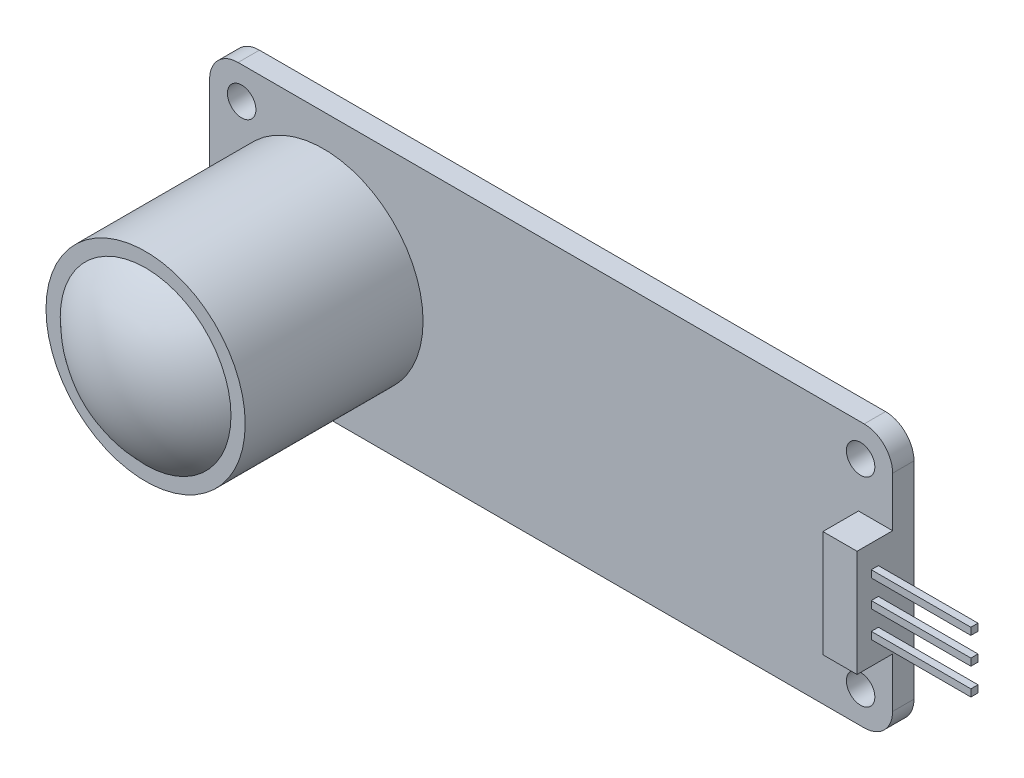
ISO-10303-21;
HEADER;
FILE_DESCRIPTION(('STEP AP214'),'2;1');
FILE_NAME('part.step','',(''),(''),'','','');
FILE_SCHEMA(('AUTOMOTIVE_DESIGN { 1 0 10303 214 1 1 1 1 }'));
ENDSEC;
DATA;
#1=APPLICATION_CONTEXT('core data for automotive mechanical design processes');
#2=APPLICATION_PROTOCOL_DEFINITION('international standard','automotive_design',2000,#1);
#3=PRODUCT_CONTEXT('',#1,'mechanical');
#4=PRODUCT('Part','Part','',(#3));
#5=PRODUCT_RELATED_PRODUCT_CATEGORY('part','',(#4));
#6=PRODUCT_DEFINITION_FORMATION('','',#4);
#7=PRODUCT_DEFINITION_CONTEXT('part definition',#1,'design');
#8=PRODUCT_DEFINITION('design','',#6,#7);
#9=PRODUCT_DEFINITION_SHAPE('','',#8);
#10=(LENGTH_UNIT() NAMED_UNIT(*) SI_UNIT(.MILLI.,.METRE.));
#11=(NAMED_UNIT(*) PLANE_ANGLE_UNIT() SI_UNIT($,.RADIAN.));
#12=(NAMED_UNIT(*) SI_UNIT($,.STERADIAN.) SOLID_ANGLE_UNIT());
#13=UNCERTAINTY_MEASURE_WITH_UNIT(LENGTH_MEASURE(1.E-05),#10,'distance_accuracy_value','');
#14=(GEOMETRIC_REPRESENTATION_CONTEXT(3) GLOBAL_UNCERTAINTY_ASSIGNED_CONTEXT((#13)) GLOBAL_UNIT_ASSIGNED_CONTEXT((#10,
#11,#12)) REPRESENTATION_CONTEXT('',''));
#15=CARTESIAN_POINT('',(0.,0.,0.));
#16=DIRECTION('',(0.,0.,1.));
#17=DIRECTION('',(1.,0.,0.));
#18=AXIS2_PLACEMENT_3D('',#15,#16,#17);
#19=CARTESIAN_POINT('',(24.,-9.25,1.5));
#20=DIRECTION('',(-1.,0.,0.));
#21=DIRECTION('',(0.,0.,1.));
#22=AXIS2_PLACEMENT_3D('',#19,#20,#21);
#23=PLANE('',#22);
#24=DIRECTION('',(0.,1.,0.));
#25=VECTOR('',#24,1.);
#26=CARTESIAN_POINT('',(24.,-0.25,2.5));
#27=LINE('',#26,#25);
#28=CARTESIAN_POINT('',(24.,-0.25,2.5));
#29=VERTEX_POINT('',#28);
#30=CARTESIAN_POINT('',(24.,0.25,2.5));
#31=VERTEX_POINT('',#30);
#32=EDGE_CURVE('E258',#29,#31,#27,.T.);
#33=ORIENTED_EDGE('',*,*,#32,.F.);
#34=DIRECTION('',(0.,0.,-1.));
#35=VECTOR('',#34,1.);
#36=CARTESIAN_POINT('',(24.,-0.25,3.));
#37=LINE('',#36,#35);
#38=CARTESIAN_POINT('',(24.,-0.25,3.));
#39=VERTEX_POINT('',#38);
#40=EDGE_CURVE('E248',#39,#29,#37,.T.);
#41=ORIENTED_EDGE('',*,*,#40,.F.);
#42=DIRECTION('',(0.,-1.,0.));
#43=VECTOR('',#42,1.);
#44=CARTESIAN_POINT('',(24.,-0.25,3.));
#45=LINE('',#44,#43);
#46=CARTESIAN_POINT('',(24.,0.25,3.));
#47=VERTEX_POINT('',#46);
#48=EDGE_CURVE('E251',#47,#39,#45,.T.);
#49=ORIENTED_EDGE('',*,*,#48,.F.);
#50=DIRECTION('',(0.,0.,1.));
#51=VECTOR('',#50,1.);
#52=CARTESIAN_POINT('',(24.,0.25,3.));
#53=LINE('',#52,#51);
#54=EDGE_CURVE('E255',#31,#47,#53,.T.);
#55=ORIENTED_EDGE('',*,*,#54,.F.);
#56=EDGE_LOOP('',(#33,#41,#49,#55));
#57=FACE_BOUND('',#56,.T.);
#58=DIRECTION('',(0.,1.,0.));
#59=VECTOR('',#58,1.);
#60=CARTESIAN_POINT('',(24.,-9.25,1.5));
#61=LINE('',#60,#59);
#62=CARTESIAN_POINT('',(24.,-7.25,1.5));
#63=VERTEX_POINT('',#62);
#64=CARTESIAN_POINT('',(24.,-3.75,1.5));
#65=VERTEX_POINT('',#64);
#66=EDGE_CURVE('E359',#63,#65,#61,.T.);
#67=ORIENTED_EDGE('',*,*,#66,.F.);
#68=DIRECTION('',(0.,0.,-1.));
#69=VECTOR('',#68,1.);
#70=CARTESIAN_POINT('',(24.,-7.25,1.5));
#71=LINE('',#70,#69);
#72=CARTESIAN_POINT('',(24.,-7.25,0.));
#73=VERTEX_POINT('',#72);
#74=EDGE_CURVE('E416',#63,#73,#71,.T.);
#75=ORIENTED_EDGE('',*,*,#74,.T.);
#76=DIRECTION('',(0.,1.,0.));
#77=VECTOR('',#76,1.);
#78=CARTESIAN_POINT('',(24.,-9.25,0.));
#79=LINE('',#78,#77);
#80=CARTESIAN_POINT('',(24.,7.25,0.));
#81=VERTEX_POINT('',#80);
#82=EDGE_CURVE('E356',#73,#81,#79,.T.);
#83=ORIENTED_EDGE('',*,*,#82,.T.);
#84=DIRECTION('',(0.,0.,-1.));
#85=VECTOR('',#84,1.);
#86=CARTESIAN_POINT('',(24.,7.25,1.5));
#87=LINE('',#86,#85);
#88=CARTESIAN_POINT('',(24.,7.25,1.5));
#89=VERTEX_POINT('',#88);
#90=EDGE_CURVE('E413',#81,#89,#87,.F.);
#91=ORIENTED_EDGE('',*,*,#90,.T.);
#92=CARTESIAN_POINT('',(24.,3.75,1.5));
#93=VERTEX_POINT('',#92);
#94=EDGE_CURVE('E362',#93,#89,#61,.T.);
#95=ORIENTED_EDGE('',*,*,#94,.F.);
#96=DIRECTION('',(0.,0.,-1.));
#97=VECTOR('',#96,1.);
#98=CARTESIAN_POINT('',(24.,3.75,4.));
#99=LINE('',#98,#97);
#100=CARTESIAN_POINT('',(24.,3.75,4.));
#101=VERTEX_POINT('',#100);
#102=EDGE_CURVE('E328',#101,#93,#99,.T.);
#103=ORIENTED_EDGE('',*,*,#102,.F.);
#104=DIRECTION('',(0.,1.,0.));
#105=VECTOR('',#104,1.);
#106=CARTESIAN_POINT('',(24.,-3.75,4.));
#107=LINE('',#106,#105);
#108=CARTESIAN_POINT('',(24.,-3.75,4.));
#109=VERTEX_POINT('',#108);
#110=EDGE_CURVE('E302',#109,#101,#107,.T.);
#111=ORIENTED_EDGE('',*,*,#110,.F.);
#112=DIRECTION('',(0.,0.,-1.));
#113=VECTOR('',#112,1.);
#114=CARTESIAN_POINT('',(24.,-3.75,4.));
#115=LINE('',#114,#113);
#116=EDGE_CURVE('E312',#109,#65,#115,.T.);
#117=ORIENTED_EDGE('',*,*,#116,.T.);
#118=EDGE_LOOP('',(#67,#75,#83,#91,#95,#103,#111,#117));
#119=FACE_BOUND('',#118,.T.);
#120=DIRECTION('',(0.,1.,0.));
#121=VECTOR('',#120,1.);
#122=CARTESIAN_POINT('',(24.,1.625,2.5));
#123=LINE('',#122,#121);
#124=CARTESIAN_POINT('',(24.,1.625,2.5));
#125=VERTEX_POINT('',#124);
#126=CARTESIAN_POINT('',(24.,2.125,2.5));
#127=VERTEX_POINT('',#126);
#128=EDGE_CURVE('E261',#125,#127,#123,.T.);
#129=ORIENTED_EDGE('',*,*,#128,.F.);
#130=DIRECTION('',(0.,0.,-1.));
#131=VECTOR('',#130,1.);
#132=CARTESIAN_POINT('',(24.,1.625,3.));
#133=LINE('',#132,#131);
#134=CARTESIAN_POINT('',(24.,1.625,3.));
#135=VERTEX_POINT('',#134);
#136=EDGE_CURVE('E273',#135,#125,#133,.T.);
#137=ORIENTED_EDGE('',*,*,#136,.F.);
#138=DIRECTION('',(0.,-1.,0.));
#139=VECTOR('',#138,1.);
#140=CARTESIAN_POINT('',(24.,1.625,3.));
#141=LINE('',#140,#139);
#142=CARTESIAN_POINT('',(24.,2.125,3.));
#143=VERTEX_POINT('',#142);
#144=EDGE_CURVE('E285',#143,#135,#141,.T.);
#145=ORIENTED_EDGE('',*,*,#144,.F.);
#146=DIRECTION('',(0.,0.,1.));
#147=VECTOR('',#146,1.);
#148=CARTESIAN_POINT('',(24.,2.125,3.));
#149=LINE('',#148,#147);
#150=EDGE_CURVE('E282',#127,#143,#149,.T.);
#151=ORIENTED_EDGE('',*,*,#150,.F.);
#152=EDGE_LOOP('',(#129,#137,#145,#151));
#153=FACE_BOUND('',#152,.T.);
#154=DIRECTION('',(0.,1.,0.));
#155=VECTOR('',#154,1.);
#156=CARTESIAN_POINT('',(24.,-2.125,2.5));
#157=LINE('',#156,#155);
#158=CARTESIAN_POINT('',(24.,-2.125,2.5));
#159=VERTEX_POINT('',#158);
#160=CARTESIAN_POINT('',(24.,-1.625,2.5));
#161=VERTEX_POINT('',#160);
#162=EDGE_CURVE('E201',#159,#161,#157,.T.);
#163=ORIENTED_EDGE('',*,*,#162,.F.);
#164=DIRECTION('',(0.,0.,-1.));
#165=VECTOR('',#164,1.);
#166=CARTESIAN_POINT('',(24.,-2.125,3.));
#167=LINE('',#166,#165);
#168=CARTESIAN_POINT('',(24.,-2.125,3.));
#169=VERTEX_POINT('',#168);
#170=EDGE_CURVE('E203',#169,#159,#167,.T.);
#171=ORIENTED_EDGE('',*,*,#170,.F.);
#172=DIRECTION('',(0.,-1.,0.));
#173=VECTOR('',#172,1.);
#174=CARTESIAN_POINT('',(24.,-2.125,3.));
#175=LINE('',#174,#173);
#176=CARTESIAN_POINT('',(24.,-1.625,3.));
#177=VERTEX_POINT('',#176);
#178=EDGE_CURVE('E64',#177,#169,#175,.T.);
#179=ORIENTED_EDGE('',*,*,#178,.F.);
#180=DIRECTION('',(0.,0.,1.));
#181=VECTOR('',#180,1.);
#182=CARTESIAN_POINT('',(24.,-1.625,3.));
#183=LINE('',#182,#181);
#184=EDGE_CURVE('E59',#161,#177,#183,.T.);
#185=ORIENTED_EDGE('',*,*,#184,.F.);
#186=EDGE_LOOP('',(#163,#171,#179,#185));
#187=FACE_BOUND('',#186,.T.);
#188=ADVANCED_FACE('F44',(#57,#119,#153,#187),#23,.F.);
#189=CARTESIAN_POINT('',(0.,0.,1.5));
#190=DIRECTION('',(0.,0.,-1.));
#191=DIRECTION('',(-1.,0.,0.));
#192=AXIS2_PLACEMENT_3D('',#189,#190,#191);
#193=PLANE('',#192);
#194=CARTESIAN_POINT('',(-21.75,-7.,1.5));
#195=DIRECTION('',(0.,0.,1.));
#196=DIRECTION('',(1.,0.,0.));
#197=AXIS2_PLACEMENT_3D('',#194,#195,#196);
#198=CIRCLE('',#197,1.);
#199=CARTESIAN_POINT('',(-20.75,-7.,1.5));
#200=VERTEX_POINT('',#199);
#201=EDGE_CURVE('E335',#200,#200,#198,.T.);
#202=ORIENTED_EDGE('',*,*,#201,.F.);
#203=EDGE_LOOP('',(#202));
#204=FACE_BOUND('',#203,.T.);
#205=CARTESIAN_POINT('',(21.75,-7.,1.5));
#206=DIRECTION('',(0.,0.,1.));
#207=DIRECTION('',(1.,0.,0.));
#208=AXIS2_PLACEMENT_3D('',#205,#206,#207);
#209=CIRCLE('',#208,1.);
#210=CARTESIAN_POINT('',(22.75,-7.,1.5));
#211=VERTEX_POINT('',#210);
#212=EDGE_CURVE('E341',#211,#211,#209,.T.);
#213=ORIENTED_EDGE('',*,*,#212,.F.);
#214=EDGE_LOOP('',(#213));
#215=FACE_BOUND('',#214,.T.);
#216=CARTESIAN_POINT('',(21.75,7.,1.5));
#217=DIRECTION('',(0.,0.,1.));
#218=DIRECTION('',(1.,0.,0.));
#219=AXIS2_PLACEMENT_3D('',#216,#217,#218);
#220=CIRCLE('',#219,1.);
#221=CARTESIAN_POINT('',(22.75,7.,1.5));
#222=VERTEX_POINT('',#221);
#223=EDGE_CURVE('E347',#222,#222,#220,.T.);
#224=ORIENTED_EDGE('',*,*,#223,.F.);
#225=EDGE_LOOP('',(#224));
#226=FACE_BOUND('',#225,.T.);
#227=CARTESIAN_POINT('',(-21.75,7.,1.5));
#228=DIRECTION('',(0.,0.,1.));
#229=DIRECTION('',(1.,0.,0.));
#230=AXIS2_PLACEMENT_3D('',#227,#228,#229);
#231=CIRCLE('',#230,1.);
#232=CARTESIAN_POINT('',(-20.75,7.,1.5));
#233=VERTEX_POINT('',#232);
#234=EDGE_CURVE('E353',#233,#233,#231,.T.);
#235=ORIENTED_EDGE('',*,*,#234,.F.);
#236=EDGE_LOOP('',(#235));
#237=FACE_BOUND('',#236,.T.);
#238=CARTESIAN_POINT('',(-16.,0.,1.5));
#239=DIRECTION('',(0.,0.,-1.));
#240=DIRECTION('',(-1.,0.,0.));
#241=AXIS2_PLACEMENT_3D('',#238,#239,#240);
#242=CIRCLE('',#241,7.);
#243=CARTESIAN_POINT('',(-23.,0.,1.5));
#244=VERTEX_POINT('',#243);
#245=EDGE_CURVE('E52',#244,#244,#242,.F.);
#246=ORIENTED_EDGE('',*,*,#245,.F.);
#247=EDGE_LOOP('',(#246));
#248=FACE_BOUND('',#247,.T.);
#249=DIRECTION('',(-1.,0.,0.));
#250=VECTOR('',#249,1.);
#251=CARTESIAN_POINT('',(24.,3.75,1.5));
#252=LINE('',#251,#250);
#253=CARTESIAN_POINT('',(21.6,3.75,1.5));
#254=VERTEX_POINT('',#253);
#255=EDGE_CURVE('E301',#93,#254,#252,.T.);
#256=ORIENTED_EDGE('',*,*,#255,.F.);
#257=ORIENTED_EDGE('',*,*,#94,.T.);
#258=CARTESIAN_POINT('',(22.,7.25,1.5));
#259=DIRECTION('',(0.,0.,-1.));
#260=DIRECTION('',(-1.,0.,0.));
#261=AXIS2_PLACEMENT_3D('',#258,#259,#260);
#262=CIRCLE('',#261,2.);
#263=CARTESIAN_POINT('',(22.,9.25,1.5));
#264=VERTEX_POINT('',#263);
#265=EDGE_CURVE('E400',#89,#264,#262,.F.);
#266=ORIENTED_EDGE('',*,*,#265,.T.);
#267=DIRECTION('',(-1.,0.,0.));
#268=VECTOR('',#267,1.);
#269=CARTESIAN_POINT('',(-24.,9.25,1.5));
#270=LINE('',#269,#268);
#271=CARTESIAN_POINT('',(-22.,9.25,1.5));
#272=VERTEX_POINT('',#271);
#273=EDGE_CURVE('E361',#264,#272,#270,.T.);
#274=ORIENTED_EDGE('',*,*,#273,.T.);
#275=CARTESIAN_POINT('',(-22.,7.25,1.5));
#276=DIRECTION('',(0.,0.,-1.));
#277=DIRECTION('',(-1.,0.,0.));
#278=AXIS2_PLACEMENT_3D('',#275,#276,#277);
#279=CIRCLE('',#278,2.);
#280=CARTESIAN_POINT('',(-24.,7.25,1.5));
#281=VERTEX_POINT('',#280);
#282=EDGE_CURVE('E404',#272,#281,#279,.F.);
#283=ORIENTED_EDGE('',*,*,#282,.T.);
#284=DIRECTION('',(0.,-1.,0.));
#285=VECTOR('',#284,1.);
#286=CARTESIAN_POINT('',(-24.,-9.25,1.5));
#287=LINE('',#286,#285);
#288=CARTESIAN_POINT('',(-24.,-7.25,1.5));
#289=VERTEX_POINT('',#288);
#290=EDGE_CURVE('E365',#281,#289,#287,.T.);
#291=ORIENTED_EDGE('',*,*,#290,.T.);
#292=CARTESIAN_POINT('',(-22.,-7.25,1.5));
#293=DIRECTION('',(0.,0.,-1.));
#294=DIRECTION('',(-1.,0.,0.));
#295=AXIS2_PLACEMENT_3D('',#292,#293,#294);
#296=CIRCLE('',#295,2.);
#297=CARTESIAN_POINT('',(-22.,-9.25,1.5));
#298=VERTEX_POINT('',#297);
#299=EDGE_CURVE('E406',#289,#298,#296,.F.);
#300=ORIENTED_EDGE('',*,*,#299,.T.);
#301=DIRECTION('',(1.,0.,0.));
#302=VECTOR('',#301,1.);
#303=CARTESIAN_POINT('',(-24.,-9.25,1.5));
#304=LINE('',#303,#302);
#305=CARTESIAN_POINT('',(22.,-9.25,1.5));
#306=VERTEX_POINT('',#305);
#307=EDGE_CURVE('E368',#298,#306,#304,.T.);
#308=ORIENTED_EDGE('',*,*,#307,.T.);
#309=CARTESIAN_POINT('',(22.,-7.25,1.5));
#310=DIRECTION('',(0.,0.,-1.));
#311=DIRECTION('',(-1.,0.,0.));
#312=AXIS2_PLACEMENT_3D('',#309,#310,#311);
#313=CIRCLE('',#312,2.);
#314=EDGE_CURVE('E402',#306,#63,#313,.F.);
#315=ORIENTED_EDGE('',*,*,#314,.T.);
#316=ORIENTED_EDGE('',*,*,#66,.T.);
#317=DIRECTION('',(1.,0.,0.));
#318=VECTOR('',#317,1.);
#319=CARTESIAN_POINT('',(24.,-3.75,1.5));
#320=LINE('',#319,#318);
#321=CARTESIAN_POINT('',(21.6,-3.75,1.5));
#322=VERTEX_POINT('',#321);
#323=EDGE_CURVE('E306',#322,#65,#320,.T.);
#324=ORIENTED_EDGE('',*,*,#323,.F.);
#325=DIRECTION('',(0.,-1.,0.));
#326=VECTOR('',#325,1.);
#327=CARTESIAN_POINT('',(21.6,-3.75,1.5));
#328=LINE('',#327,#326);
#329=EDGE_CURVE('E315',#254,#322,#328,.T.);
#330=ORIENTED_EDGE('',*,*,#329,.F.);
#331=EDGE_LOOP('',(#256,#257,#266,#274,#283,#291,#300,#308,#315,#316,#324,#330));
#332=FACE_BOUND('',#331,.T.);
#333=ADVANCED_FACE('F423',(#204,#215,#226,#237,#248,#332),#193,.F.);
#334=CARTESIAN_POINT('',(0.,0.,0.));
#335=DIRECTION('',(0.,0.,-1.));
#336=DIRECTION('',(-1.,0.,0.));
#337=AXIS2_PLACEMENT_3D('',#334,#335,#336);
#338=PLANE('',#337);
#339=CARTESIAN_POINT('',(21.75,-7.,0.));
#340=DIRECTION('',(0.,0.,1.));
#341=DIRECTION('',(1.,0.,0.));
#342=AXIS2_PLACEMENT_3D('',#339,#340,#341);
#343=CIRCLE('',#342,1.);
#344=CARTESIAN_POINT('',(22.75,-7.,0.));
#345=VERTEX_POINT('',#344);
#346=EDGE_CURVE('E338',#345,#345,#343,.T.);
#347=ORIENTED_EDGE('',*,*,#346,.T.);
#348=EDGE_LOOP('',(#347));
#349=FACE_BOUND('',#348,.T.);
#350=CARTESIAN_POINT('',(-21.75,7.,0.));
#351=DIRECTION('',(0.,0.,1.));
#352=DIRECTION('',(1.,0.,0.));
#353=AXIS2_PLACEMENT_3D('',#350,#351,#352);
#354=CIRCLE('',#353,1.);
#355=CARTESIAN_POINT('',(-20.75,7.,0.));
#356=VERTEX_POINT('',#355);
#357=EDGE_CURVE('E350',#356,#356,#354,.T.);
#358=ORIENTED_EDGE('',*,*,#357,.T.);
#359=EDGE_LOOP('',(#358));
#360=FACE_BOUND('',#359,.T.);
#361=DIRECTION('',(1.,0.,0.));
#362=VECTOR('',#361,1.);
#363=CARTESIAN_POINT('',(-24.,-9.25,0.));
#364=LINE('',#363,#362);
#365=CARTESIAN_POINT('',(-22.,-9.25,0.));
#366=VERTEX_POINT('',#365);
#367=CARTESIAN_POINT('',(22.,-9.25,0.));
#368=VERTEX_POINT('',#367);
#369=EDGE_CURVE('E380',#366,#368,#364,.T.);
#370=ORIENTED_EDGE('',*,*,#369,.F.);
#371=CARTESIAN_POINT('',(-22.,-7.25,0.));
#372=DIRECTION('',(0.,0.,-1.));
#373=DIRECTION('',(-1.,0.,0.));
#374=AXIS2_PLACEMENT_3D('',#371,#372,#373);
#375=CIRCLE('',#374,2.);
#376=CARTESIAN_POINT('',(-24.,-7.25,0.));
#377=VERTEX_POINT('',#376);
#378=EDGE_CURVE('E393',#366,#377,#375,.T.);
#379=ORIENTED_EDGE('',*,*,#378,.T.);
#380=DIRECTION('',(0.,-1.,0.));
#381=VECTOR('',#380,1.);
#382=CARTESIAN_POINT('',(-24.,-9.25,0.));
#383=LINE('',#382,#381);
#384=CARTESIAN_POINT('',(-24.,7.25,0.));
#385=VERTEX_POINT('',#384);
#386=EDGE_CURVE('E377',#385,#377,#383,.T.);
#387=ORIENTED_EDGE('',*,*,#386,.F.);
#388=CARTESIAN_POINT('',(-22.,7.25,0.));
#389=DIRECTION('',(0.,0.,-1.));
#390=DIRECTION('',(-1.,0.,0.));
#391=AXIS2_PLACEMENT_3D('',#388,#389,#390);
#392=CIRCLE('',#391,2.);
#393=CARTESIAN_POINT('',(-22.,9.25,0.));
#394=VERTEX_POINT('',#393);
#395=EDGE_CURVE('E391',#385,#394,#392,.T.);
#396=ORIENTED_EDGE('',*,*,#395,.T.);
#397=DIRECTION('',(-1.,0.,0.));
#398=VECTOR('',#397,1.);
#399=CARTESIAN_POINT('',(-24.,9.25,0.));
#400=LINE('',#399,#398);
#401=CARTESIAN_POINT('',(22.,9.25,0.));
#402=VERTEX_POINT('',#401);
#403=EDGE_CURVE('E374',#402,#394,#400,.T.);
#404=ORIENTED_EDGE('',*,*,#403,.F.);
#405=CARTESIAN_POINT('',(22.,7.25,0.));
#406=DIRECTION('',(0.,0.,-1.));
#407=DIRECTION('',(-1.,0.,0.));
#408=AXIS2_PLACEMENT_3D('',#405,#406,#407);
#409=CIRCLE('',#408,2.);
#410=EDGE_CURVE('E387',#402,#81,#409,.T.);
#411=ORIENTED_EDGE('',*,*,#410,.T.);
#412=ORIENTED_EDGE('',*,*,#82,.F.);
#413=CARTESIAN_POINT('',(22.,-7.25,0.));
#414=DIRECTION('',(0.,0.,-1.));
#415=DIRECTION('',(-1.,0.,0.));
#416=AXIS2_PLACEMENT_3D('',#413,#414,#415);
#417=CIRCLE('',#416,2.);
#418=EDGE_CURVE('E389',#73,#368,#417,.T.);
#419=ORIENTED_EDGE('',*,*,#418,.T.);
#420=EDGE_LOOP('',(#370,#379,#387,#396,#404,#411,#412,#419));
#421=FACE_BOUND('',#420,.T.);
#422=CARTESIAN_POINT('',(21.75,7.,0.));
#423=DIRECTION('',(0.,0.,1.));
#424=DIRECTION('',(1.,0.,0.));
#425=AXIS2_PLACEMENT_3D('',#422,#423,#424);
#426=CIRCLE('',#425,1.);
#427=CARTESIAN_POINT('',(22.75,7.,0.));
#428=VERTEX_POINT('',#427);
#429=EDGE_CURVE('E344',#428,#428,#426,.T.);
#430=ORIENTED_EDGE('',*,*,#429,.T.);
#431=EDGE_LOOP('',(#430));
#432=FACE_BOUND('',#431,.T.);
#433=CARTESIAN_POINT('',(-21.75,-7.,0.));
#434=DIRECTION('',(0.,0.,1.));
#435=DIRECTION('',(1.,0.,0.));
#436=AXIS2_PLACEMENT_3D('',#433,#434,#435);
#437=CIRCLE('',#436,1.);
#438=CARTESIAN_POINT('',(-20.75,-7.,0.));
#439=VERTEX_POINT('',#438);
#440=EDGE_CURVE('E334',#439,#439,#437,.T.);
#441=ORIENTED_EDGE('',*,*,#440,.T.);
#442=EDGE_LOOP('',(#441));
#443=FACE_BOUND('',#442,.T.);
#444=ADVANCED_FACE('F426',(#349,#360,#421,#432,#443),#338,.T.);
#445=CARTESIAN_POINT('',(-24.,9.25,1.5));
#446=DIRECTION('',(0.,-1.,0.));
#447=DIRECTION('',(0.,0.,-1.));
#448=AXIS2_PLACEMENT_3D('',#445,#446,#447);
#449=PLANE('',#448);
#450=ORIENTED_EDGE('',*,*,#403,.T.);
#451=DIRECTION('',(0.,0.,-1.));
#452=VECTOR('',#451,1.);
#453=CARTESIAN_POINT('',(-22.,9.25,1.5));
#454=LINE('',#453,#452);
#455=EDGE_CURVE('E411',#394,#272,#454,.F.);
#456=ORIENTED_EDGE('',*,*,#455,.T.);
#457=ORIENTED_EDGE('',*,*,#273,.F.);
#458=DIRECTION('',(0.,0.,-1.));
#459=VECTOR('',#458,1.);
#460=CARTESIAN_POINT('',(22.,9.25,1.5));
#461=LINE('',#460,#459);
#462=EDGE_CURVE('E408',#264,#402,#461,.T.);
#463=ORIENTED_EDGE('',*,*,#462,.T.);
#464=EDGE_LOOP('',(#450,#456,#457,#463));
#465=FACE_BOUND('',#464,.T.);
#466=ADVANCED_FACE('F446',(#465),#449,.F.);
#467=CARTESIAN_POINT('',(-24.,-9.25,1.5));
#468=DIRECTION('',(1.,0.,0.));
#469=DIRECTION('',(0.,0.,-1.));
#470=AXIS2_PLACEMENT_3D('',#467,#468,#469);
#471=PLANE('',#470);
#472=ORIENTED_EDGE('',*,*,#386,.T.);
#473=DIRECTION('',(0.,0.,-1.));
#474=VECTOR('',#473,1.);
#475=CARTESIAN_POINT('',(-24.,-7.25,1.5));
#476=LINE('',#475,#474);
#477=EDGE_CURVE('E398',#377,#289,#476,.F.);
#478=ORIENTED_EDGE('',*,*,#477,.T.);
#479=ORIENTED_EDGE('',*,*,#290,.F.);
#480=DIRECTION('',(0.,0.,-1.));
#481=VECTOR('',#480,1.);
#482=CARTESIAN_POINT('',(-24.,7.25,1.5));
#483=LINE('',#482,#481);
#484=EDGE_CURVE('E395',#281,#385,#483,.T.);
#485=ORIENTED_EDGE('',*,*,#484,.T.);
#486=EDGE_LOOP('',(#472,#478,#479,#485));
#487=FACE_BOUND('',#486,.T.);
#488=ADVANCED_FACE('F455',(#487),#471,.F.);
#489=CARTESIAN_POINT('',(-24.,-9.25,1.5));
#490=DIRECTION('',(0.,1.,0.));
#491=DIRECTION('',(0.,0.,1.));
#492=AXIS2_PLACEMENT_3D('',#489,#490,#491);
#493=PLANE('',#492);
#494=ORIENTED_EDGE('',*,*,#307,.F.);
#495=DIRECTION('',(0.,0.,-1.));
#496=VECTOR('',#495,1.);
#497=CARTESIAN_POINT('',(-22.,-9.25,1.5));
#498=LINE('',#497,#496);
#499=EDGE_CURVE('E384',#298,#366,#498,.T.);
#500=ORIENTED_EDGE('',*,*,#499,.T.);
#501=ORIENTED_EDGE('',*,*,#369,.T.);
#502=DIRECTION('',(0.,0.,-1.));
#503=VECTOR('',#502,1.);
#504=CARTESIAN_POINT('',(22.,-9.25,1.5));
#505=LINE('',#504,#503);
#506=EDGE_CURVE('E371',#368,#306,#505,.F.);
#507=ORIENTED_EDGE('',*,*,#506,.T.);
#508=EDGE_LOOP('',(#494,#500,#501,#507));
#509=FACE_BOUND('',#508,.T.);
#510=ADVANCED_FACE('F464',(#509),#493,.F.);
#511=CARTESIAN_POINT('',(-21.75,7.,1.5));
#512=DIRECTION('',(0.,0.,-1.));
#513=DIRECTION('',(-1.,0.,0.));
#514=AXIS2_PLACEMENT_3D('',#511,#512,#513);
#515=CYLINDRICAL_SURFACE('',#514,1.);
#516=ORIENTED_EDGE('',*,*,#234,.T.);
#517=EDGE_LOOP('',(#516));
#518=FACE_BOUND('',#517,.T.);
#519=ORIENTED_EDGE('',*,*,#357,.F.);
#520=EDGE_LOOP('',(#519));
#521=FACE_BOUND('',#520,.T.);
#522=ADVANCED_FACE('F534',(#518,#521),#515,.F.);
#523=CARTESIAN_POINT('',(21.75,7.,1.5));
#524=DIRECTION('',(0.,0.,-1.));
#525=DIRECTION('',(-1.,0.,0.));
#526=AXIS2_PLACEMENT_3D('',#523,#524,#525);
#527=CYLINDRICAL_SURFACE('',#526,1.);
#528=ORIENTED_EDGE('',*,*,#223,.T.);
#529=EDGE_LOOP('',(#528));
#530=FACE_BOUND('',#529,.T.);
#531=ORIENTED_EDGE('',*,*,#429,.F.);
#532=EDGE_LOOP('',(#531));
#533=FACE_BOUND('',#532,.T.);
#534=ADVANCED_FACE('F530',(#530,#533),#527,.F.);
#535=CARTESIAN_POINT('',(21.75,-7.,1.5));
#536=DIRECTION('',(0.,0.,-1.));
#537=DIRECTION('',(-1.,0.,0.));
#538=AXIS2_PLACEMENT_3D('',#535,#536,#537);
#539=CYLINDRICAL_SURFACE('',#538,1.);
#540=ORIENTED_EDGE('',*,*,#212,.T.);
#541=EDGE_LOOP('',(#540));
#542=FACE_BOUND('',#541,.T.);
#543=ORIENTED_EDGE('',*,*,#346,.F.);
#544=EDGE_LOOP('',(#543));
#545=FACE_BOUND('',#544,.T.);
#546=ADVANCED_FACE('F526',(#542,#545),#539,.F.);
#547=CARTESIAN_POINT('',(-21.75,-7.,1.5));
#548=DIRECTION('',(0.,0.,-1.));
#549=DIRECTION('',(-1.,0.,0.));
#550=AXIS2_PLACEMENT_3D('',#547,#548,#549);
#551=CYLINDRICAL_SURFACE('',#550,1.);
#552=ORIENTED_EDGE('',*,*,#201,.T.);
#553=EDGE_LOOP('',(#552));
#554=FACE_BOUND('',#553,.T.);
#555=ORIENTED_EDGE('',*,*,#440,.F.);
#556=EDGE_LOOP('',(#555));
#557=FACE_BOUND('',#556,.T.);
#558=ADVANCED_FACE('F503',(#554,#557),#551,.F.);
#559=CARTESIAN_POINT('',(-22.,-7.25,1.5));
#560=DIRECTION('',(0.,0.,-1.));
#561=DIRECTION('',(-1.,0.,0.));
#562=AXIS2_PLACEMENT_3D('',#559,#560,#561);
#563=CYLINDRICAL_SURFACE('',#562,2.);
#564=ORIENTED_EDGE('',*,*,#299,.F.);
#565=ORIENTED_EDGE('',*,*,#477,.F.);
#566=ORIENTED_EDGE('',*,*,#378,.F.);
#567=ORIENTED_EDGE('',*,*,#499,.F.);
#568=EDGE_LOOP('',(#564,#565,#566,#567));
#569=FACE_BOUND('',#568,.T.);
#570=ADVANCED_FACE('F459',(#569),#563,.T.);
#571=CARTESIAN_POINT('',(-22.,7.25,1.5));
#572=DIRECTION('',(0.,0.,-1.));
#573=DIRECTION('',(-1.,0.,0.));
#574=AXIS2_PLACEMENT_3D('',#571,#572,#573);
#575=CYLINDRICAL_SURFACE('',#574,2.);
#576=ORIENTED_EDGE('',*,*,#282,.F.);
#577=ORIENTED_EDGE('',*,*,#455,.F.);
#578=ORIENTED_EDGE('',*,*,#395,.F.);
#579=ORIENTED_EDGE('',*,*,#484,.F.);
#580=EDGE_LOOP('',(#576,#577,#578,#579));
#581=FACE_BOUND('',#580,.T.);
#582=ADVANCED_FACE('F450',(#581),#575,.T.);
#583=CARTESIAN_POINT('',(22.,-7.25,1.5));
#584=DIRECTION('',(0.,0.,-1.));
#585=DIRECTION('',(-1.,0.,0.));
#586=AXIS2_PLACEMENT_3D('',#583,#584,#585);
#587=CYLINDRICAL_SURFACE('',#586,2.);
#588=ORIENTED_EDGE('',*,*,#314,.F.);
#589=ORIENTED_EDGE('',*,*,#506,.F.);
#590=ORIENTED_EDGE('',*,*,#418,.F.);
#591=ORIENTED_EDGE('',*,*,#74,.F.);
#592=EDGE_LOOP('',(#588,#589,#590,#591));
#593=FACE_BOUND('',#592,.T.);
#594=ADVANCED_FACE('F468',(#593),#587,.T.);
#595=CARTESIAN_POINT('',(22.,7.25,1.5));
#596=DIRECTION('',(0.,0.,-1.));
#597=DIRECTION('',(-1.,0.,0.));
#598=AXIS2_PLACEMENT_3D('',#595,#596,#597);
#599=CYLINDRICAL_SURFACE('',#598,2.);
#600=ORIENTED_EDGE('',*,*,#265,.F.);
#601=ORIENTED_EDGE('',*,*,#90,.F.);
#602=ORIENTED_EDGE('',*,*,#410,.F.);
#603=ORIENTED_EDGE('',*,*,#462,.F.);
#604=EDGE_LOOP('',(#600,#601,#602,#603));
#605=FACE_BOUND('',#604,.T.);
#606=ADVANCED_FACE('F46',(#605),#599,.T.);
#607=CARTESIAN_POINT('',(-16.,0.,14.));
#608=DIRECTION('',(0.,0.,-1.));
#609=DIRECTION('',(-1.,0.,0.));
#610=AXIS2_PLACEMENT_3D('',#607,#608,#609);
#611=CYLINDRICAL_SURFACE('',#610,7.);
#612=CARTESIAN_POINT('',(-16.,0.,14.));
#613=DIRECTION('',(0.,0.,1.));
#614=DIRECTION('',(1.,0.,0.));
#615=AXIS2_PLACEMENT_3D('',#612,#613,#614);
#616=CIRCLE('',#615,7.);
#617=CARTESIAN_POINT('',(-9.,0.,14.));
#618=VERTEX_POINT('',#617);
#619=EDGE_CURVE('E331',#618,#618,#616,.T.);
#620=ORIENTED_EDGE('',*,*,#619,.F.);
#621=EDGE_LOOP('',(#620));
#622=FACE_BOUND('',#621,.T.);
#623=ORIENTED_EDGE('',*,*,#245,.T.);
#624=EDGE_LOOP('',(#623));
#625=FACE_BOUND('',#624,.T.);
#626=ADVANCED_FACE('F421',(#622,#625),#611,.T.);
#627=CARTESIAN_POINT('',(-16.,0.,14.));
#628=DIRECTION('',(0.,0.,1.));
#629=DIRECTION('',(1.,0.,0.));
#630=AXIS2_PLACEMENT_3D('',#627,#628,#629);
#631=PLANE('',#630);
#632=CARTESIAN_POINT('',(-16.,0.,14.));
#633=DIRECTION('',(0.,0.,1.));
#634=DIRECTION('',(1.,0.,0.));
#635=AXIS2_PLACEMENT_3D('',#632,#633,#634);
#636=CIRCLE('',#635,6.);
#637=CARTESIAN_POINT('',(-10.,0.,14.));
#638=VERTEX_POINT('',#637);
#639=EDGE_CURVE('E11',#638,#638,#636,.T.);
#640=ORIENTED_EDGE('',*,*,#639,.F.);
#641=EDGE_LOOP('',(#640));
#642=FACE_BOUND('',#641,.T.);
#643=ORIENTED_EDGE('',*,*,#619,.T.);
#644=EDGE_LOOP('',(#643));
#645=FACE_BOUND('',#644,.T.);
#646=ADVANCED_FACE('F512',(#642,#645),#631,.T.);
#647=CARTESIAN_POINT('',(-16.,0.,8.05));
#648=DIRECTION('',(0.,0.,1.));
#649=DIRECTION('',(-1.,0.,0.));
#650=AXIS2_PLACEMENT_3D('',#647,#648,#649);
#651=SPHERICAL_SURFACE('',#650,8.45);
#652=ORIENTED_EDGE('',*,*,#639,.T.);
#653=EDGE_LOOP('',(#652));
#654=FACE_BOUND('',#653,.T.);
#655=ADVANCED_FACE('F518',(#654),#651,.T.);
#656=CARTESIAN_POINT('',(24.,3.75,4.));
#657=DIRECTION('',(0.,-1.,0.));
#658=DIRECTION('',(1.,0.,0.));
#659=AXIS2_PLACEMENT_3D('',#656,#657,#658);
#660=PLANE('',#659);
#661=ORIENTED_EDGE('',*,*,#255,.T.);
#662=DIRECTION('',(0.,0.,-1.));
#663=VECTOR('',#662,1.);
#664=CARTESIAN_POINT('',(21.6,3.75,4.));
#665=LINE('',#664,#663);
#666=CARTESIAN_POINT('',(21.6,3.75,4.));
#667=VERTEX_POINT('',#666);
#668=EDGE_CURVE('E325',#667,#254,#665,.T.);
#669=ORIENTED_EDGE('',*,*,#668,.F.);
#670=DIRECTION('',(-1.,0.,0.));
#671=VECTOR('',#670,1.);
#672=CARTESIAN_POINT('',(24.,3.75,4.));
#673=LINE('',#672,#671);
#674=EDGE_CURVE('E305',#101,#667,#673,.T.);
#675=ORIENTED_EDGE('',*,*,#674,.F.);
#676=ORIENTED_EDGE('',*,*,#102,.T.);
#677=EDGE_LOOP('',(#661,#669,#675,#676));
#678=FACE_BOUND('',#677,.T.);
#679=ADVANCED_FACE('F433',(#678),#660,.F.);
#680=CARTESIAN_POINT('',(21.6,-3.75,4.));
#681=DIRECTION('',(1.,0.,0.));
#682=DIRECTION('',(0.,0.,-1.));
#683=AXIS2_PLACEMENT_3D('',#680,#681,#682);
#684=PLANE('',#683);
#685=ORIENTED_EDGE('',*,*,#329,.T.);
#686=DIRECTION('',(0.,0.,-1.));
#687=VECTOR('',#686,1.);
#688=CARTESIAN_POINT('',(21.6,-3.75,4.));
#689=LINE('',#688,#687);
#690=CARTESIAN_POINT('',(21.6,-3.75,4.));
#691=VERTEX_POINT('',#690);
#692=EDGE_CURVE('E322',#691,#322,#689,.T.);
#693=ORIENTED_EDGE('',*,*,#692,.F.);
#694=DIRECTION('',(0.,-1.,0.));
#695=VECTOR('',#694,1.);
#696=CARTESIAN_POINT('',(21.6,-3.75,4.));
#697=LINE('',#696,#695);
#698=EDGE_CURVE('E308',#667,#691,#697,.T.);
#699=ORIENTED_EDGE('',*,*,#698,.F.);
#700=ORIENTED_EDGE('',*,*,#668,.T.);
#701=EDGE_LOOP('',(#685,#693,#699,#700));
#702=FACE_BOUND('',#701,.T.);
#703=ADVANCED_FACE('F476',(#702),#684,.F.);
#704=CARTESIAN_POINT('',(24.,-3.75,4.));
#705=DIRECTION('',(0.,1.,0.));
#706=DIRECTION('',(-1.,0.,0.));
#707=AXIS2_PLACEMENT_3D('',#704,#705,#706);
#708=PLANE('',#707);
#709=ORIENTED_EDGE('',*,*,#323,.T.);
#710=ORIENTED_EDGE('',*,*,#116,.F.);
#711=DIRECTION('',(1.,0.,0.));
#712=VECTOR('',#711,1.);
#713=CARTESIAN_POINT('',(24.,-3.75,4.));
#714=LINE('',#713,#712);
#715=EDGE_CURVE('E310',#691,#109,#714,.T.);
#716=ORIENTED_EDGE('',*,*,#715,.F.);
#717=ORIENTED_EDGE('',*,*,#692,.T.);
#718=EDGE_LOOP('',(#709,#710,#716,#717));
#719=FACE_BOUND('',#718,.T.);
#720=ADVANCED_FACE('F473',(#719),#708,.F.);
#721=CARTESIAN_POINT('',(0.,0.,4.));
#722=DIRECTION('',(0.,0.,1.));
#723=DIRECTION('',(1.,0.,0.));
#724=AXIS2_PLACEMENT_3D('',#721,#722,#723);
#725=PLANE('',#724);
#726=ORIENTED_EDGE('',*,*,#110,.T.);
#727=ORIENTED_EDGE('',*,*,#674,.T.);
#728=ORIENTED_EDGE('',*,*,#698,.T.);
#729=ORIENTED_EDGE('',*,*,#715,.T.);
#730=EDGE_LOOP('',(#726,#727,#728,#729));
#731=FACE_BOUND('',#730,.T.);
#732=ADVANCED_FACE('F479',(#731),#725,.T.);
#733=CARTESIAN_POINT('',(31.,1.625,2.5));
#734=DIRECTION('',(0.,0.,1.));
#735=DIRECTION('',(1.,0.,0.));
#736=AXIS2_PLACEMENT_3D('',#733,#734,#735);
#737=PLANE('',#736);
#738=ORIENTED_EDGE('',*,*,#128,.T.);
#739=DIRECTION('',(-1.,0.,0.));
#740=VECTOR('',#739,1.);
#741=CARTESIAN_POINT('',(31.,2.125,2.5));
#742=LINE('',#741,#740);
#743=CARTESIAN_POINT('',(31.,2.125,2.5));
#744=VERTEX_POINT('',#743);
#745=EDGE_CURVE('E298',#744,#127,#742,.T.);
#746=ORIENTED_EDGE('',*,*,#745,.F.);
#747=DIRECTION('',(0.,1.,0.));
#748=VECTOR('',#747,1.);
#749=CARTESIAN_POINT('',(31.,1.625,2.5));
#750=LINE('',#749,#748);
#751=CARTESIAN_POINT('',(31.,1.625,2.5));
#752=VERTEX_POINT('',#751);
#753=EDGE_CURVE('E269',#752,#744,#750,.T.);
#754=ORIENTED_EDGE('',*,*,#753,.F.);
#755=DIRECTION('',(-1.,0.,0.));
#756=VECTOR('',#755,1.);
#757=CARTESIAN_POINT('',(31.,1.625,2.5));
#758=LINE('',#757,#756);
#759=EDGE_CURVE('E279',#752,#125,#758,.T.);
#760=ORIENTED_EDGE('',*,*,#759,.T.);
#761=EDGE_LOOP('',(#738,#746,#754,#760));
#762=FACE_BOUND('',#761,.T.);
#763=ADVANCED_FACE('F481',(#762),#737,.F.);
#764=CARTESIAN_POINT('',(31.,2.125,3.));
#765=DIRECTION('',(0.,-1.,0.));
#766=DIRECTION('',(0.,0.,-1.));
#767=AXIS2_PLACEMENT_3D('',#764,#765,#766);
#768=PLANE('',#767);
#769=ORIENTED_EDGE('',*,*,#150,.T.);
#770=DIRECTION('',(-1.,0.,0.));
#771=VECTOR('',#770,1.);
#772=CARTESIAN_POINT('',(31.,2.125,3.));
#773=LINE('',#772,#771);
#774=CARTESIAN_POINT('',(31.,2.125,3.));
#775=VERTEX_POINT('',#774);
#776=EDGE_CURVE('E295',#775,#143,#773,.T.);
#777=ORIENTED_EDGE('',*,*,#776,.F.);
#778=DIRECTION('',(0.,0.,1.));
#779=VECTOR('',#778,1.);
#780=CARTESIAN_POINT('',(31.,2.125,3.));
#781=LINE('',#780,#779);
#782=EDGE_CURVE('E272',#744,#775,#781,.T.);
#783=ORIENTED_EDGE('',*,*,#782,.F.);
#784=ORIENTED_EDGE('',*,*,#745,.T.);
#785=EDGE_LOOP('',(#769,#777,#783,#784));
#786=FACE_BOUND('',#785,.T.);
#787=ADVANCED_FACE('F487',(#786),#768,.F.);
#788=CARTESIAN_POINT('',(31.,1.625,3.));
#789=DIRECTION('',(0.,0.,-1.));
#790=DIRECTION('',(-1.,0.,0.));
#791=AXIS2_PLACEMENT_3D('',#788,#789,#790);
#792=PLANE('',#791);
#793=ORIENTED_EDGE('',*,*,#144,.T.);
#794=DIRECTION('',(-1.,0.,0.));
#795=VECTOR('',#794,1.);
#796=CARTESIAN_POINT('',(31.,1.625,3.));
#797=LINE('',#796,#795);
#798=CARTESIAN_POINT('',(31.,1.625,3.));
#799=VERTEX_POINT('',#798);
#800=EDGE_CURVE('E292',#799,#135,#797,.T.);
#801=ORIENTED_EDGE('',*,*,#800,.F.);
#802=DIRECTION('',(0.,-1.,0.));
#803=VECTOR('',#802,1.);
#804=CARTESIAN_POINT('',(31.,1.625,3.));
#805=LINE('',#804,#803);
#806=EDGE_CURVE('E275',#775,#799,#805,.T.);
#807=ORIENTED_EDGE('',*,*,#806,.F.);
#808=ORIENTED_EDGE('',*,*,#776,.T.);
#809=EDGE_LOOP('',(#793,#801,#807,#808));
#810=FACE_BOUND('',#809,.T.);
#811=ADVANCED_FACE('F614',(#810),#792,.F.);
#812=CARTESIAN_POINT('',(31.,1.625,3.));
#813=DIRECTION('',(0.,1.,0.));
#814=DIRECTION('',(0.,0.,1.));
#815=AXIS2_PLACEMENT_3D('',#812,#813,#814);
#816=PLANE('',#815);
#817=ORIENTED_EDGE('',*,*,#136,.T.);
#818=ORIENTED_EDGE('',*,*,#759,.F.);
#819=DIRECTION('',(0.,0.,-1.));
#820=VECTOR('',#819,1.);
#821=CARTESIAN_POINT('',(31.,1.625,3.));
#822=LINE('',#821,#820);
#823=EDGE_CURVE('E277',#799,#752,#822,.T.);
#824=ORIENTED_EDGE('',*,*,#823,.F.);
#825=ORIENTED_EDGE('',*,*,#800,.T.);
#826=EDGE_LOOP('',(#817,#818,#824,#825));
#827=FACE_BOUND('',#826,.T.);
#828=ADVANCED_FACE('F625',(#827),#816,.F.);
#829=CARTESIAN_POINT('',(31.,0.,0.));
#830=DIRECTION('',(-1.,0.,0.));
#831=DIRECTION('',(0.,0.,1.));
#832=AXIS2_PLACEMENT_3D('',#829,#830,#831);
#833=PLANE('',#832);
#834=ORIENTED_EDGE('',*,*,#753,.T.);
#835=ORIENTED_EDGE('',*,*,#782,.T.);
#836=ORIENTED_EDGE('',*,*,#806,.T.);
#837=ORIENTED_EDGE('',*,*,#823,.T.);
#838=EDGE_LOOP('',(#834,#835,#836,#837));
#839=FACE_BOUND('',#838,.T.);
#840=ADVANCED_FACE('F636',(#839),#833,.F.);
#841=CARTESIAN_POINT('',(31.,-0.25,2.5));
#842=DIRECTION('',(0.,0.,1.));
#843=DIRECTION('',(1.,0.,0.));
#844=AXIS2_PLACEMENT_3D('',#841,#842,#843);
#845=PLANE('',#844);
#846=ORIENTED_EDGE('',*,*,#32,.T.);
#847=DIRECTION('',(-1.,0.,0.));
#848=VECTOR('',#847,1.);
#849=CARTESIAN_POINT('',(31.,0.25,2.5));
#850=LINE('',#849,#848);
#851=CARTESIAN_POINT('',(31.,0.25,2.5));
#852=VERTEX_POINT('',#851);
#853=EDGE_CURVE('E207',#852,#31,#850,.T.);
#854=ORIENTED_EDGE('',*,*,#853,.F.);
#855=DIRECTION('',(0.,1.,0.));
#856=VECTOR('',#855,1.);
#857=CARTESIAN_POINT('',(31.,-0.25,2.5));
#858=LINE('',#857,#856);
#859=CARTESIAN_POINT('',(31.,-0.25,2.5));
#860=VERTEX_POINT('',#859);
#861=EDGE_CURVE('E252',#860,#852,#858,.T.);
#862=ORIENTED_EDGE('',*,*,#861,.F.);
#863=DIRECTION('',(-1.,0.,0.));
#864=VECTOR('',#863,1.);
#865=CARTESIAN_POINT('',(31.,-0.25,2.5));
#866=LINE('',#865,#864);
#867=EDGE_CURVE('E244',#860,#29,#866,.T.);
#868=ORIENTED_EDGE('',*,*,#867,.T.);
#869=EDGE_LOOP('',(#846,#854,#862,#868));
#870=FACE_BOUND('',#869,.T.);
#871=ADVANCED_FACE('F647',(#870),#845,.F.);
#872=CARTESIAN_POINT('',(31.,0.25,3.));
#873=DIRECTION('',(0.,-1.,0.));
#874=DIRECTION('',(0.,0.,-1.));
#875=AXIS2_PLACEMENT_3D('',#872,#873,#874);
#876=PLANE('',#875);
#877=ORIENTED_EDGE('',*,*,#54,.T.);
#878=DIRECTION('',(-1.,0.,0.));
#879=VECTOR('',#878,1.);
#880=CARTESIAN_POINT('',(31.,0.25,3.));
#881=LINE('',#880,#879);
#882=CARTESIAN_POINT('',(31.,0.25,3.));
#883=VERTEX_POINT('',#882);
#884=EDGE_CURVE('E238',#883,#47,#881,.T.);
#885=ORIENTED_EDGE('',*,*,#884,.F.);
#886=DIRECTION('',(0.,0.,1.));
#887=VECTOR('',#886,1.);
#888=CARTESIAN_POINT('',(31.,0.25,3.));
#889=LINE('',#888,#887);
#890=EDGE_CURVE('E265',#852,#883,#889,.T.);
#891=ORIENTED_EDGE('',*,*,#890,.F.);
#892=ORIENTED_EDGE('',*,*,#853,.T.);
#893=EDGE_LOOP('',(#877,#885,#891,#892));
#894=FACE_BOUND('',#893,.T.);
#895=ADVANCED_FACE('F658',(#894),#876,.F.);
#896=CARTESIAN_POINT('',(31.,-0.25,3.));
#897=DIRECTION('',(0.,0.,-1.));
#898=DIRECTION('',(-1.,0.,0.));
#899=AXIS2_PLACEMENT_3D('',#896,#897,#898);
#900=PLANE('',#899);
#901=ORIENTED_EDGE('',*,*,#48,.T.);
#902=DIRECTION('',(-1.,0.,0.));
#903=VECTOR('',#902,1.);
#904=CARTESIAN_POINT('',(31.,-0.25,3.));
#905=LINE('',#904,#903);
#906=CARTESIAN_POINT('',(31.,-0.25,3.));
#907=VERTEX_POINT('',#906);
#908=EDGE_CURVE('E241',#907,#39,#905,.T.);
#909=ORIENTED_EDGE('',*,*,#908,.F.);
#910=DIRECTION('',(0.,-1.,0.));
#911=VECTOR('',#910,1.);
#912=CARTESIAN_POINT('',(31.,-0.25,3.));
#913=LINE('',#912,#911);
#914=EDGE_CURVE('E263',#883,#907,#913,.T.);
#915=ORIENTED_EDGE('',*,*,#914,.F.);
#916=ORIENTED_EDGE('',*,*,#884,.T.);
#917=EDGE_LOOP('',(#901,#909,#915,#916));
#918=FACE_BOUND('',#917,.T.);
#919=ADVANCED_FACE('F669',(#918),#900,.F.);
#920=CARTESIAN_POINT('',(31.,-0.25,3.));
#921=DIRECTION('',(0.,1.,0.));
#922=DIRECTION('',(0.,0.,1.));
#923=AXIS2_PLACEMENT_3D('',#920,#921,#922);
#924=PLANE('',#923);
#925=ORIENTED_EDGE('',*,*,#40,.T.);
#926=ORIENTED_EDGE('',*,*,#867,.F.);
#927=DIRECTION('',(0.,0.,-1.));
#928=VECTOR('',#927,1.);
#929=CARTESIAN_POINT('',(31.,-0.25,3.));
#930=LINE('',#929,#928);
#931=EDGE_CURVE('E247',#907,#860,#930,.T.);
#932=ORIENTED_EDGE('',*,*,#931,.F.);
#933=ORIENTED_EDGE('',*,*,#908,.T.);
#934=EDGE_LOOP('',(#925,#926,#932,#933));
#935=FACE_BOUND('',#934,.T.);
#936=ADVANCED_FACE('F680',(#935),#924,.F.);
#937=CARTESIAN_POINT('',(31.,0.,0.));
#938=DIRECTION('',(-1.,0.,0.));
#939=DIRECTION('',(0.,0.,1.));
#940=AXIS2_PLACEMENT_3D('',#937,#938,#939);
#941=PLANE('',#940);
#942=ORIENTED_EDGE('',*,*,#861,.T.);
#943=ORIENTED_EDGE('',*,*,#890,.T.);
#944=ORIENTED_EDGE('',*,*,#914,.T.);
#945=ORIENTED_EDGE('',*,*,#931,.T.);
#946=EDGE_LOOP('',(#942,#943,#944,#945));
#947=FACE_BOUND('',#946,.T.);
#948=ADVANCED_FACE('F691',(#947),#941,.F.);
#949=CARTESIAN_POINT('',(31.,-2.125,2.5));
#950=DIRECTION('',(0.,0.,1.));
#951=DIRECTION('',(1.,0.,0.));
#952=AXIS2_PLACEMENT_3D('',#949,#950,#951);
#953=PLANE('',#952);
#954=ORIENTED_EDGE('',*,*,#162,.T.);
#955=DIRECTION('',(-1.,0.,0.));
#956=VECTOR('',#955,1.);
#957=CARTESIAN_POINT('',(31.,-1.625,2.5));
#958=LINE('',#957,#956);
#959=CARTESIAN_POINT('',(31.,-1.625,2.5));
#960=VERTEX_POINT('',#959);
#961=EDGE_CURVE('E774',#960,#161,#958,.T.);
#962=ORIENTED_EDGE('',*,*,#961,.F.);
#963=DIRECTION('',(0.,1.,0.));
#964=VECTOR('',#963,1.);
#965=CARTESIAN_POINT('',(31.,-2.125,2.5));
#966=LINE('',#965,#964);
#967=CARTESIAN_POINT('',(31.,-2.125,2.5));
#968=VERTEX_POINT('',#967);
#969=EDGE_CURVE('E218',#968,#960,#966,.T.);
#970=ORIENTED_EDGE('',*,*,#969,.F.);
#971=DIRECTION('',(-1.,0.,0.));
#972=VECTOR('',#971,1.);
#973=CARTESIAN_POINT('',(31.,-2.125,2.5));
#974=LINE('',#973,#972);
#975=EDGE_CURVE('E214',#968,#159,#974,.T.);
#976=ORIENTED_EDGE('',*,*,#975,.T.);
#977=EDGE_LOOP('',(#954,#962,#970,#976));
#978=FACE_BOUND('',#977,.T.);
#979=ADVANCED_FACE('F220',(#978),#953,.F.);
#980=CARTESIAN_POINT('',(31.,-1.625,3.));
#981=DIRECTION('',(0.,-1.,0.));
#982=DIRECTION('',(0.,0.,-1.));
#983=AXIS2_PLACEMENT_3D('',#980,#981,#982);
#984=PLANE('',#983);
#985=ORIENTED_EDGE('',*,*,#184,.T.);
#986=DIRECTION('',(-1.,0.,0.));
#987=VECTOR('',#986,1.);
#988=CARTESIAN_POINT('',(31.,-1.625,3.));
#989=LINE('',#988,#987);
#990=CARTESIAN_POINT('',(31.,-1.625,3.));
#991=VERTEX_POINT('',#990);
#992=EDGE_CURVE('E226',#991,#177,#989,.T.);
#993=ORIENTED_EDGE('',*,*,#992,.F.);
#994=DIRECTION('',(0.,0.,1.));
#995=VECTOR('',#994,1.);
#996=CARTESIAN_POINT('',(31.,-1.625,3.));
#997=LINE('',#996,#995);
#998=EDGE_CURVE('E233',#960,#991,#997,.T.);
#999=ORIENTED_EDGE('',*,*,#998,.F.);
#1000=ORIENTED_EDGE('',*,*,#961,.T.);
#1001=EDGE_LOOP('',(#985,#993,#999,#1000));
#1002=FACE_BOUND('',#1001,.T.);
#1003=ADVANCED_FACE('F712',(#1002),#984,.F.);
#1004=CARTESIAN_POINT('',(31.,-2.125,3.));
#1005=DIRECTION('',(0.,0.,-1.));
#1006=DIRECTION('',(-1.,0.,0.));
#1007=AXIS2_PLACEMENT_3D('',#1004,#1005,#1006);
#1008=PLANE('',#1007);
#1009=ORIENTED_EDGE('',*,*,#178,.T.);
#1010=DIRECTION('',(-1.,0.,0.));
#1011=VECTOR('',#1010,1.);
#1012=CARTESIAN_POINT('',(31.,-2.125,3.));
#1013=LINE('',#1012,#1011);
#1014=CARTESIAN_POINT('',(31.,-2.125,3.));
#1015=VERTEX_POINT('',#1014);
#1016=EDGE_CURVE('E217',#1015,#169,#1013,.T.);
#1017=ORIENTED_EDGE('',*,*,#1016,.F.);
#1018=DIRECTION('',(0.,-1.,0.));
#1019=VECTOR('',#1018,1.);
#1020=CARTESIAN_POINT('',(31.,-2.125,3.));
#1021=LINE('',#1020,#1019);
#1022=EDGE_CURVE('E224',#991,#1015,#1021,.T.);
#1023=ORIENTED_EDGE('',*,*,#1022,.F.);
#1024=ORIENTED_EDGE('',*,*,#992,.T.);
#1025=EDGE_LOOP('',(#1009,#1017,#1023,#1024));
#1026=FACE_BOUND('',#1025,.T.);
#1027=ADVANCED_FACE('F722',(#1026),#1008,.F.);
#1028=CARTESIAN_POINT('',(31.,-2.125,3.));
#1029=DIRECTION('',(0.,1.,0.));
#1030=DIRECTION('',(0.,0.,1.));
#1031=AXIS2_PLACEMENT_3D('',#1028,#1029,#1030);
#1032=PLANE('',#1031);
#1033=ORIENTED_EDGE('',*,*,#170,.T.);
#1034=ORIENTED_EDGE('',*,*,#975,.F.);
#1035=DIRECTION('',(0.,0.,-1.));
#1036=VECTOR('',#1035,1.);
#1037=CARTESIAN_POINT('',(31.,-2.125,3.));
#1038=LINE('',#1037,#1036);
#1039=EDGE_CURVE('E222',#1015,#968,#1038,.T.);
#1040=ORIENTED_EDGE('',*,*,#1039,.F.);
#1041=ORIENTED_EDGE('',*,*,#1016,.T.);
#1042=EDGE_LOOP('',(#1033,#1034,#1040,#1041));
#1043=FACE_BOUND('',#1042,.T.);
#1044=ADVANCED_FACE('F212',(#1043),#1032,.F.);
#1045=CARTESIAN_POINT('',(31.,0.,0.));
#1046=DIRECTION('',(-1.,0.,0.));
#1047=DIRECTION('',(0.,0.,1.));
#1048=AXIS2_PLACEMENT_3D('',#1045,#1046,#1047);
#1049=PLANE('',#1048);
#1050=ORIENTED_EDGE('',*,*,#969,.T.);
#1051=ORIENTED_EDGE('',*,*,#998,.T.);
#1052=ORIENTED_EDGE('',*,*,#1022,.T.);
#1053=ORIENTED_EDGE('',*,*,#1039,.T.);
#1054=EDGE_LOOP('',(#1050,#1051,#1052,#1053));
#1055=FACE_BOUND('',#1054,.T.);
#1056=ADVANCED_FACE('F743',(#1055),#1049,.F.);
#1057=CLOSED_SHELL('',(#188,#333,#444,#466,#488,#510,#522,#534,#546,#558,#570,#582,#594,#606,
#626,#646,#655,#679,#703,#720,#732,#763,#787,#811,#828,#840,#871,#895,#919,#936,#948,#979,#1003,
#1027,#1044,#1056));
#1058=MANIFOLD_SOLID_BREP('B2',#1057);
#1059=ADVANCED_BREP_SHAPE_REPRESENTATION('',(#18,#1058),#14);
#1060=SHAPE_DEFINITION_REPRESENTATION(#9,#1059);
ENDSEC;
END-ISO-10303-21;
